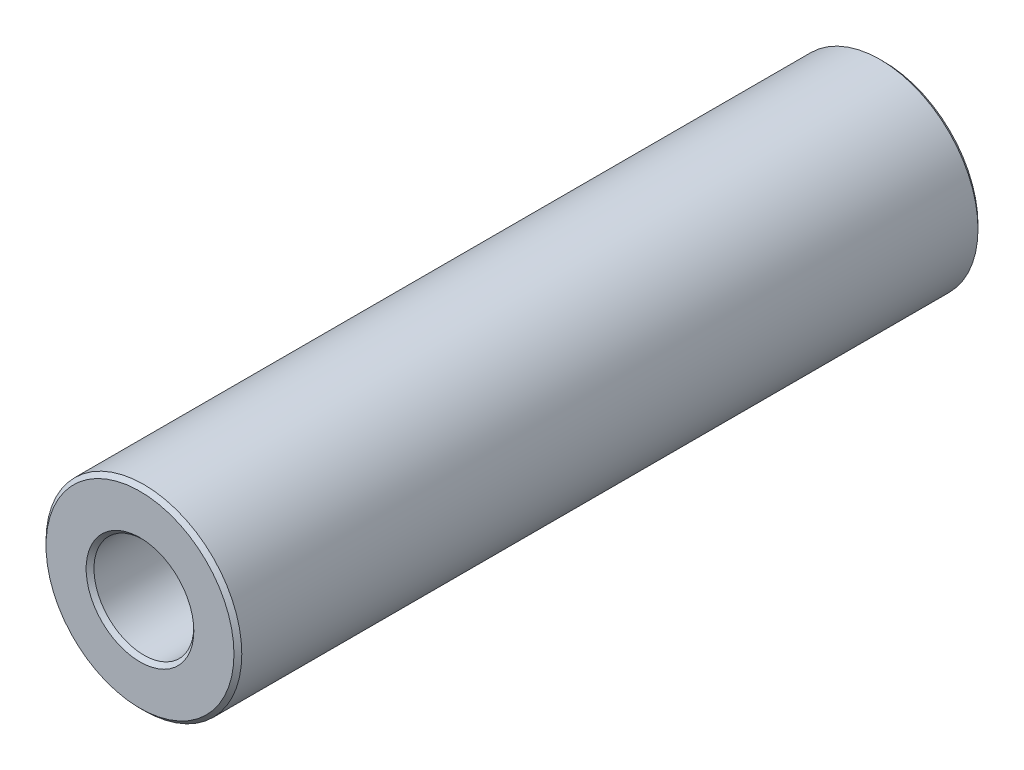
ISO-10303-21;
HEADER;
FILE_DESCRIPTION(('STEP AP214'),'2;1');
FILE_NAME('part.step','',(''),(''),'','','');
FILE_SCHEMA(('AUTOMOTIVE_DESIGN { 1 0 10303 214 1 1 1 1 }'));
ENDSEC;
DATA;
#1=APPLICATION_CONTEXT('core data for automotive mechanical design processes');
#2=APPLICATION_PROTOCOL_DEFINITION('international standard','automotive_design',2000,#1);
#3=PRODUCT_CONTEXT('',#1,'mechanical');
#4=PRODUCT('Part','Part','',(#3));
#5=PRODUCT_RELATED_PRODUCT_CATEGORY('part','',(#4));
#6=PRODUCT_DEFINITION_FORMATION('','',#4);
#7=PRODUCT_DEFINITION_CONTEXT('part definition',#1,'design');
#8=PRODUCT_DEFINITION('design','',#6,#7);
#9=PRODUCT_DEFINITION_SHAPE('','',#8);
#10=(LENGTH_UNIT() NAMED_UNIT(*) SI_UNIT(.MILLI.,.METRE.));
#11=(NAMED_UNIT(*) PLANE_ANGLE_UNIT() SI_UNIT($,.RADIAN.));
#12=(NAMED_UNIT(*) SI_UNIT($,.STERADIAN.) SOLID_ANGLE_UNIT());
#13=UNCERTAINTY_MEASURE_WITH_UNIT(LENGTH_MEASURE(1.E-05),#10,'distance_accuracy_value','');
#14=(GEOMETRIC_REPRESENTATION_CONTEXT(3) GLOBAL_UNCERTAINTY_ASSIGNED_CONTEXT((#13)) GLOBAL_UNIT_ASSIGNED_CONTEXT((#10,
#11,#12)) REPRESENTATION_CONTEXT('',''));
#15=CARTESIAN_POINT('',(0.,0.,0.));
#16=DIRECTION('',(0.,0.,1.));
#17=DIRECTION('',(1.,0.,0.));
#18=AXIS2_PLACEMENT_3D('',#15,#16,#17);
#19=CARTESIAN_POINT('',(0.,0.,38.));
#20=DIRECTION('',(0.,0.,1.));
#21=DIRECTION('',(1.,0.,0.));
#22=AXIS2_PLACEMENT_3D('',#19,#20,#21);
#23=PLANE('',#22);
#24=CARTESIAN_POINT('',(0.,0.,38.));
#25=DIRECTION('',(0.,0.,1.));
#26=DIRECTION('',(1.,0.,0.));
#27=AXIS2_PLACEMENT_3D('',#24,#25,#26);
#28=CIRCLE('',#27,2.75000000000001);
#29=CARTESIAN_POINT('',(2.75000000000001,0.,38.));
#30=VERTEX_POINT('',#29);
#31=EDGE_CURVE('E10',#30,#30,#28,.F.);
#32=ORIENTED_EDGE('',*,*,#31,.T.);
#33=EDGE_LOOP('',(#32));
#34=FACE_BOUND('',#33,.T.);
#35=CARTESIAN_POINT('',(0.,0.,38.));
#36=DIRECTION('',(0.,0.,1.));
#37=DIRECTION('',(1.,0.,0.));
#38=AXIS2_PLACEMENT_3D('',#35,#36,#37);
#39=CIRCLE('',#38,4.80000000000001);
#40=CARTESIAN_POINT('',(4.80000000000001,0.,38.));
#41=VERTEX_POINT('',#40);
#42=EDGE_CURVE('E38',#41,#41,#39,.T.);
#43=ORIENTED_EDGE('',*,*,#42,.T.);
#44=EDGE_LOOP('',(#43));
#45=FACE_BOUND('',#44,.T.);
#46=ADVANCED_FACE('F31',(#34,#45),#23,.T.);
#47=CARTESIAN_POINT('',(0.,0.,0.));
#48=DIRECTION('',(0.,0.,1.));
#49=DIRECTION('',(1.,0.,0.));
#50=AXIS2_PLACEMENT_3D('',#47,#48,#49);
#51=PLANE('',#50);
#52=CARTESIAN_POINT('',(0.,0.,0.));
#53=DIRECTION('',(0.,0.,1.));
#54=DIRECTION('',(1.,0.,0.));
#55=AXIS2_PLACEMENT_3D('',#52,#53,#54);
#56=CIRCLE('',#55,4.79999999999999);
#57=CARTESIAN_POINT('',(4.79999999999999,0.,0.));
#58=VERTEX_POINT('',#57);
#59=EDGE_CURVE('E51',#58,#58,#56,.F.);
#60=ORIENTED_EDGE('',*,*,#59,.T.);
#61=EDGE_LOOP('',(#60));
#62=FACE_BOUND('',#61,.T.);
#63=CARTESIAN_POINT('',(0.,0.,0.));
#64=DIRECTION('',(0.,0.,1.));
#65=DIRECTION('',(1.,0.,0.));
#66=AXIS2_PLACEMENT_3D('',#63,#64,#65);
#67=CIRCLE('',#66,2.75);
#68=CARTESIAN_POINT('',(2.75,0.,0.));
#69=VERTEX_POINT('',#68);
#70=EDGE_CURVE('E54',#69,#69,#67,.T.);
#71=ORIENTED_EDGE('',*,*,#70,.T.);
#72=EDGE_LOOP('',(#71));
#73=FACE_BOUND('',#72,.T.);
#74=ADVANCED_FACE('F75',(#62,#73),#51,.F.);
#75=CARTESIAN_POINT('',(0.,0.,38.));
#76=DIRECTION('',(0.,0.,-1.));
#77=DIRECTION('',(-1.,0.,0.));
#78=AXIS2_PLACEMENT_3D('',#75,#76,#77);
#79=CYLINDRICAL_SURFACE('',#78,5.);
#80=CARTESIAN_POINT('',(0.,0.,0.200000000000006));
#81=DIRECTION('',(0.,0.,1.));
#82=DIRECTION('',(1.,0.,0.));
#83=AXIS2_PLACEMENT_3D('',#80,#81,#82);
#84=CIRCLE('',#83,5.);
#85=CARTESIAN_POINT('',(5.,0.,0.200000000000006));
#86=VERTEX_POINT('',#85);
#87=EDGE_CURVE('E57',#86,#86,#84,.T.);
#88=ORIENTED_EDGE('',*,*,#87,.T.);
#89=EDGE_LOOP('',(#88));
#90=FACE_BOUND('',#89,.T.);
#91=CARTESIAN_POINT('',(0.,0.,37.8));
#92=DIRECTION('',(0.,0.,1.));
#93=DIRECTION('',(1.,0.,0.));
#94=AXIS2_PLACEMENT_3D('',#91,#92,#93);
#95=CIRCLE('',#94,5.);
#96=CARTESIAN_POINT('',(5.,0.,37.8));
#97=VERTEX_POINT('',#96);
#98=EDGE_CURVE('E60',#97,#97,#95,.F.);
#99=ORIENTED_EDGE('',*,*,#98,.T.);
#100=EDGE_LOOP('',(#99));
#101=FACE_BOUND('',#100,.T.);
#102=ADVANCED_FACE('F64',(#90,#101),#79,.T.);
#103=CARTESIAN_POINT('',(0.,0.,38.));
#104=DIRECTION('',(0.,0.,-1.));
#105=DIRECTION('',(-1.,0.,0.));
#106=AXIS2_PLACEMENT_3D('',#103,#104,#105);
#107=CYLINDRICAL_SURFACE('',#106,2.55);
#108=CARTESIAN_POINT('',(0.,0.,0.199999999999999));
#109=DIRECTION('',(0.,0.,1.));
#110=DIRECTION('',(1.,0.,0.));
#111=AXIS2_PLACEMENT_3D('',#108,#109,#110);
#112=CIRCLE('',#111,2.55);
#113=CARTESIAN_POINT('',(2.55,0.,0.199999999999999));
#114=VERTEX_POINT('',#113);
#115=EDGE_CURVE('E42',#114,#114,#112,.F.);
#116=ORIENTED_EDGE('',*,*,#115,.T.);
#117=EDGE_LOOP('',(#116));
#118=FACE_BOUND('',#117,.T.);
#119=CARTESIAN_POINT('',(0.,0.,37.8));
#120=DIRECTION('',(0.,0.,1.));
#121=DIRECTION('',(1.,0.,0.));
#122=AXIS2_PLACEMENT_3D('',#119,#120,#121);
#123=CIRCLE('',#122,2.55);
#124=CARTESIAN_POINT('',(2.55,0.,37.8));
#125=VERTEX_POINT('',#124);
#126=EDGE_CURVE('E46',#125,#125,#123,.T.);
#127=ORIENTED_EDGE('',*,*,#126,.T.);
#128=EDGE_LOOP('',(#127));
#129=FACE_BOUND('',#128,.T.);
#130=ADVANCED_FACE('F83',(#118,#129),#107,.F.);
#131=CARTESIAN_POINT('',(0.,0.,0.200000000000006));
#132=DIRECTION('',(0.,0.,1.));
#133=DIRECTION('',(1.,0.,0.));
#134=AXIS2_PLACEMENT_3D('',#131,#132,#133);
#135=CONICAL_SURFACE('',#134,5.,0.785398163397455);
#136=ORIENTED_EDGE('',*,*,#59,.F.);
#137=EDGE_LOOP('',(#136));
#138=FACE_BOUND('',#137,.T.);
#139=ORIENTED_EDGE('',*,*,#87,.F.);
#140=EDGE_LOOP('',(#139));
#141=FACE_BOUND('',#140,.T.);
#142=ADVANCED_FACE('F88',(#138,#141),#135,.T.);
#143=CARTESIAN_POINT('',(0.,0.,0.));
#144=DIRECTION('',(0.,0.,-1.));
#145=DIRECTION('',(-1.,0.,0.));
#146=AXIS2_PLACEMENT_3D('',#143,#144,#145);
#147=CONICAL_SURFACE('',#146,2.75,0.785398163397449);
#148=ORIENTED_EDGE('',*,*,#115,.F.);
#149=EDGE_LOOP('',(#148));
#150=FACE_BOUND('',#149,.T.);
#151=ORIENTED_EDGE('',*,*,#70,.F.);
#152=EDGE_LOOP('',(#151));
#153=FACE_BOUND('',#152,.T.);
#154=ADVANCED_FACE('F72',(#150,#153),#147,.F.);
#155=CARTESIAN_POINT('',(0.,0.,37.8));
#156=DIRECTION('',(0.,0.,1.));
#157=DIRECTION('',(1.,0.,0.));
#158=AXIS2_PLACEMENT_3D('',#155,#156,#157);
#159=CONICAL_SURFACE('',#158,2.55,0.785398163397432);
#160=ORIENTED_EDGE('',*,*,#31,.F.);
#161=EDGE_LOOP('',(#160));
#162=FACE_BOUND('',#161,.T.);
#163=ORIENTED_EDGE('',*,*,#126,.F.);
#164=EDGE_LOOP('',(#163));
#165=FACE_BOUND('',#164,.T.);
#166=ADVANCED_FACE('F68',(#162,#165),#159,.F.);
#167=CARTESIAN_POINT('',(0.,0.,38.));
#168=DIRECTION('',(0.,0.,-1.));
#169=DIRECTION('',(-1.,0.,0.));
#170=AXIS2_PLACEMENT_3D('',#167,#168,#169);
#171=CONICAL_SURFACE('',#170,4.80000000000001,0.785398163397455);
#172=ORIENTED_EDGE('',*,*,#98,.F.);
#173=EDGE_LOOP('',(#172));
#174=FACE_BOUND('',#173,.T.);
#175=ORIENTED_EDGE('',*,*,#42,.F.);
#176=EDGE_LOOP('',(#175));
#177=FACE_BOUND('',#176,.T.);
#178=ADVANCED_FACE('F33',(#174,#177),#171,.T.);
#179=CLOSED_SHELL('',(#46,#74,#102,#130,#142,#154,#166,#178));
#180=MANIFOLD_SOLID_BREP('B2',#179);
#181=ADVANCED_BREP_SHAPE_REPRESENTATION('',(#18,#180),#14);
#182=SHAPE_DEFINITION_REPRESENTATION(#9,#181);
ENDSEC;
END-ISO-10303-21;
